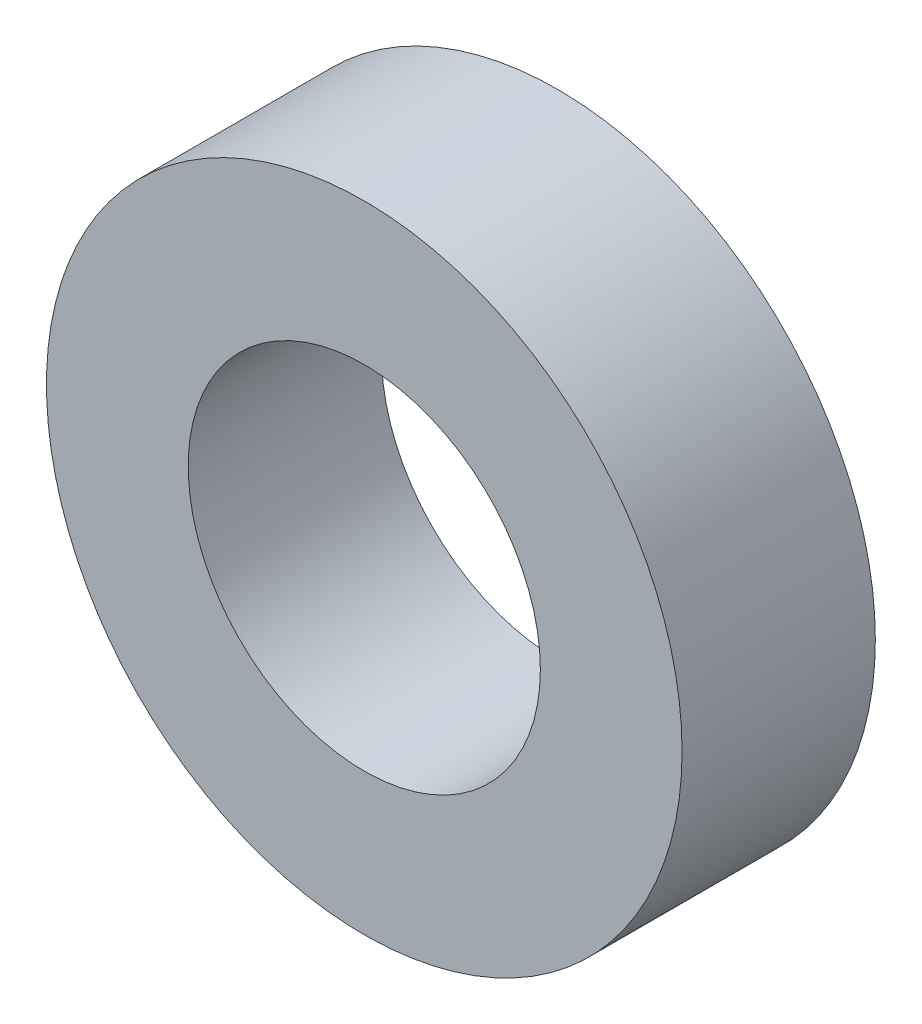
ISO-10303-21;
HEADER;
FILE_DESCRIPTION(('STEP AP214'),'2;1');
FILE_NAME('part.step','',(''),(''),'','','');
FILE_SCHEMA(('AUTOMOTIVE_DESIGN { 1 0 10303 214 1 1 1 1 }'));
ENDSEC;
DATA;
#1=APPLICATION_CONTEXT('core data for automotive mechanical design processes');
#2=APPLICATION_PROTOCOL_DEFINITION('international standard','automotive_design',2000,#1);
#3=PRODUCT_CONTEXT('',#1,'mechanical');
#4=PRODUCT('Part','Part','',(#3));
#5=PRODUCT_RELATED_PRODUCT_CATEGORY('part','',(#4));
#6=PRODUCT_DEFINITION_FORMATION('','',#4);
#7=PRODUCT_DEFINITION_CONTEXT('part definition',#1,'design');
#8=PRODUCT_DEFINITION('design','',#6,#7);
#9=PRODUCT_DEFINITION_SHAPE('','',#8);
#10=(LENGTH_UNIT() NAMED_UNIT(*) SI_UNIT(.MILLI.,.METRE.));
#11=(NAMED_UNIT(*) PLANE_ANGLE_UNIT() SI_UNIT($,.RADIAN.));
#12=(NAMED_UNIT(*) SI_UNIT($,.STERADIAN.) SOLID_ANGLE_UNIT());
#13=UNCERTAINTY_MEASURE_WITH_UNIT(LENGTH_MEASURE(1.E-05),#10,'distance_accuracy_value','');
#14=(GEOMETRIC_REPRESENTATION_CONTEXT(3) GLOBAL_UNCERTAINTY_ASSIGNED_CONTEXT((#13)) GLOBAL_UNIT_ASSIGNED_CONTEXT((#10,
#11,#12)) REPRESENTATION_CONTEXT('',''));
#15=CARTESIAN_POINT('',(0.,0.,0.));
#16=DIRECTION('',(0.,0.,1.));
#17=DIRECTION('',(1.,0.,0.));
#18=AXIS2_PLACEMENT_3D('',#15,#16,#17);
#19=CARTESIAN_POINT('',(0.,0.,4.5));
#20=DIRECTION('',(0.,0.,1.));
#21=DIRECTION('',(1.,0.,0.));
#22=AXIS2_PLACEMENT_3D('',#19,#20,#21);
#23=PLANE('',#22);
#24=CARTESIAN_POINT('',(0.,0.,4.5));
#25=DIRECTION('',(0.,0.,1.));
#26=DIRECTION('',(1.,0.,0.));
#27=AXIS2_PLACEMENT_3D('',#24,#25,#26);
#28=CIRCLE('',#27,7.4);
#29=CARTESIAN_POINT('',(7.4,0.,4.5));
#30=VERTEX_POINT('',#29);
#31=EDGE_CURVE('E10',#30,#30,#28,.T.);
#32=ORIENTED_EDGE('',*,*,#31,.T.);
#33=EDGE_LOOP('',(#32));
#34=FACE_BOUND('',#33,.T.);
#35=CARTESIAN_POINT('',(0.,0.,4.5));
#36=DIRECTION('',(0.,0.,1.));
#37=DIRECTION('',(1.,0.,0.));
#38=AXIS2_PLACEMENT_3D('',#35,#36,#37);
#39=CIRCLE('',#38,4.1);
#40=CARTESIAN_POINT('',(4.1,0.,4.5));
#41=VERTEX_POINT('',#40);
#42=EDGE_CURVE('E50',#41,#41,#39,.T.);
#43=ORIENTED_EDGE('',*,*,#42,.F.);
#44=EDGE_LOOP('',(#43));
#45=FACE_BOUND('',#44,.T.);
#46=ADVANCED_FACE('F37',(#34,#45),#23,.T.);
#47=CARTESIAN_POINT('',(0.,0.,0.));
#48=DIRECTION('',(0.,0.,1.));
#49=DIRECTION('',(1.,0.,0.));
#50=AXIS2_PLACEMENT_3D('',#47,#48,#49);
#51=PLANE('',#50);
#52=CARTESIAN_POINT('',(0.,0.,0.));
#53=DIRECTION('',(0.,0.,1.));
#54=DIRECTION('',(1.,0.,0.));
#55=AXIS2_PLACEMENT_3D('',#52,#53,#54);
#56=CIRCLE('',#55,7.4);
#57=CARTESIAN_POINT('',(7.4,0.,0.));
#58=VERTEX_POINT('',#57);
#59=EDGE_CURVE('E41',#58,#58,#56,.T.);
#60=ORIENTED_EDGE('',*,*,#59,.F.);
#61=EDGE_LOOP('',(#60));
#62=FACE_BOUND('',#61,.T.);
#63=CARTESIAN_POINT('',(0.,0.,0.));
#64=DIRECTION('',(0.,0.,1.));
#65=DIRECTION('',(1.,0.,0.));
#66=AXIS2_PLACEMENT_3D('',#63,#64,#65);
#67=CIRCLE('',#66,4.1);
#68=CARTESIAN_POINT('',(4.1,0.,0.));
#69=VERTEX_POINT('',#68);
#70=EDGE_CURVE('E52',#69,#69,#67,.T.);
#71=ORIENTED_EDGE('',*,*,#70,.T.);
#72=EDGE_LOOP('',(#71));
#73=FACE_BOUND('',#72,.T.);
#74=ADVANCED_FACE('F64',(#62,#73),#51,.F.);
#75=CARTESIAN_POINT('',(0.,0.,4.5));
#76=DIRECTION('',(0.,0.,-1.));
#77=DIRECTION('',(-1.,0.,0.));
#78=AXIS2_PLACEMENT_3D('',#75,#76,#77);
#79=CYLINDRICAL_SURFACE('',#78,7.4);
#80=ORIENTED_EDGE('',*,*,#31,.F.);
#81=EDGE_LOOP('',(#80));
#82=FACE_BOUND('',#81,.T.);
#83=ORIENTED_EDGE('',*,*,#59,.T.);
#84=EDGE_LOOP('',(#83));
#85=FACE_BOUND('',#84,.T.);
#86=ADVANCED_FACE('F39',(#82,#85),#79,.T.);
#87=CARTESIAN_POINT('',(0.,0.,4.5));
#88=DIRECTION('',(0.,0.,-1.));
#89=DIRECTION('',(-1.,0.,0.));
#90=AXIS2_PLACEMENT_3D('',#87,#88,#89);
#91=CYLINDRICAL_SURFACE('',#90,4.1);
#92=ORIENTED_EDGE('',*,*,#42,.T.);
#93=EDGE_LOOP('',(#92));
#94=FACE_BOUND('',#93,.T.);
#95=ORIENTED_EDGE('',*,*,#70,.F.);
#96=EDGE_LOOP('',(#95));
#97=FACE_BOUND('',#96,.T.);
#98=ADVANCED_FACE('F60',(#94,#97),#91,.F.);
#99=CLOSED_SHELL('',(#46,#74,#86,#98));
#100=MANIFOLD_SOLID_BREP('B2',#99);
#101=ADVANCED_BREP_SHAPE_REPRESENTATION('',(#18,#100),#14);
#102=SHAPE_DEFINITION_REPRESENTATION(#9,#101);
ENDSEC;
END-ISO-10303-21;
